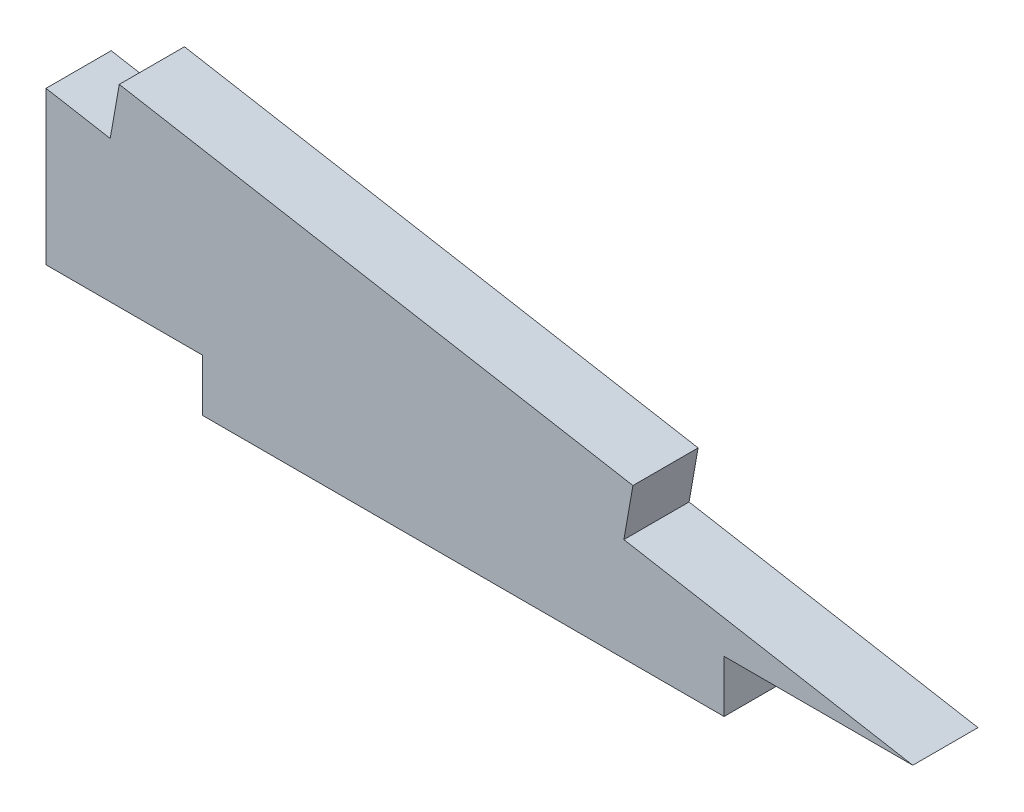
ISO-10303-21;
HEADER;
FILE_DESCRIPTION(('STEP AP214'),'2;1');
FILE_NAME('part.step','',(''),(''),'','','');
FILE_SCHEMA(('AUTOMOTIVE_DESIGN { 1 0 10303 214 1 1 1 1 }'));
ENDSEC;
DATA;
#1=APPLICATION_CONTEXT('core data for automotive mechanical design processes');
#2=APPLICATION_PROTOCOL_DEFINITION('international standard','automotive_design',2000,#1);
#3=PRODUCT_CONTEXT('',#1,'mechanical');
#4=PRODUCT('Part','Part','',(#3));
#5=PRODUCT_RELATED_PRODUCT_CATEGORY('part','',(#4));
#6=PRODUCT_DEFINITION_FORMATION('','',#4);
#7=PRODUCT_DEFINITION_CONTEXT('part definition',#1,'design');
#8=PRODUCT_DEFINITION('design','',#6,#7);
#9=PRODUCT_DEFINITION_SHAPE('','',#8);
#10=(LENGTH_UNIT() NAMED_UNIT(*) SI_UNIT(.MILLI.,.METRE.));
#11=(NAMED_UNIT(*) PLANE_ANGLE_UNIT() SI_UNIT($,.RADIAN.));
#12=(NAMED_UNIT(*) SI_UNIT($,.STERADIAN.) SOLID_ANGLE_UNIT());
#13=UNCERTAINTY_MEASURE_WITH_UNIT(LENGTH_MEASURE(1.E-05),#10,'distance_accuracy_value','');
#14=(GEOMETRIC_REPRESENTATION_CONTEXT(3) GLOBAL_UNCERTAINTY_ASSIGNED_CONTEXT((#13)) GLOBAL_UNIT_ASSIGNED_CONTEXT((#10,
#11,#12)) REPRESENTATION_CONTEXT('',''));
#15=CARTESIAN_POINT('',(0.,0.,0.));
#16=DIRECTION('',(0.,0.,1.));
#17=DIRECTION('',(1.,0.,0.));
#18=AXIS2_PLACEMENT_3D('',#15,#16,#17);
#19=CARTESIAN_POINT('',(-22.4517437496762,2.92182886603974,5.));
#20=DIRECTION('',(0.,1.,0.));
#21=DIRECTION('',(-1.,0.,0.));
#22=AXIS2_PLACEMENT_3D('',#19,#20,#21);
#23=PLANE('',#22);
#24=DIRECTION('',(1.,0.,0.));
#25=VECTOR('',#24,1.);
#26=CARTESIAN_POINT('',(-22.4517437496762,2.92182886603974,0.));
#27=LINE('',#26,#25);
#28=CARTESIAN_POINT('',(-22.4517437496762,2.92182886603974,0.));
#29=VERTEX_POINT('',#28);
#30=CARTESIAN_POINT('',(17.5482562503238,2.92182886603975,0.));
#31=VERTEX_POINT('',#30);
#32=EDGE_CURVE('E157',#29,#31,#27,.T.);
#33=ORIENTED_EDGE('',*,*,#32,.T.);
#34=DIRECTION('',(0.,0.,-1.));
#35=VECTOR('',#34,1.);
#36=CARTESIAN_POINT('',(17.5482562503238,2.92182886603975,5.));
#37=LINE('',#36,#35);
#38=CARTESIAN_POINT('',(17.5482562503238,2.92182886603975,5.));
#39=VERTEX_POINT('',#38);
#40=EDGE_CURVE('E11',#39,#31,#37,.T.);
#41=ORIENTED_EDGE('',*,*,#40,.F.);
#42=DIRECTION('',(1.,0.,0.));
#43=VECTOR('',#42,1.);
#44=CARTESIAN_POINT('',(-22.4517437496762,2.92182886603974,5.));
#45=LINE('',#44,#43);
#46=CARTESIAN_POINT('',(-22.4517437496762,2.92182886603974,5.));
#47=VERTEX_POINT('',#46);
#48=EDGE_CURVE('E179',#47,#39,#45,.T.);
#49=ORIENTED_EDGE('',*,*,#48,.F.);
#50=DIRECTION('',(0.,0.,-1.));
#51=VECTOR('',#50,1.);
#52=CARTESIAN_POINT('',(-22.4517437496762,2.92182886603974,5.));
#53=LINE('',#52,#51);
#54=EDGE_CURVE('E153',#47,#29,#53,.T.);
#55=ORIENTED_EDGE('',*,*,#54,.T.);
#56=EDGE_LOOP('',(#33,#41,#49,#55));
#57=FACE_BOUND('',#56,.T.);
#58=ADVANCED_FACE('F43',(#57),#23,.F.);
#59=CARTESIAN_POINT('',(17.5482562503238,2.92182886603975,5.));
#60=DIRECTION('',(-1.,0.,0.));
#61=DIRECTION('',(0.,0.,1.));
#62=AXIS2_PLACEMENT_3D('',#59,#60,#61);
#63=PLANE('',#62);
#64=DIRECTION('',(0.,1.,0.));
#65=VECTOR('',#64,1.);
#66=CARTESIAN_POINT('',(17.5482562503238,2.92182886603975,0.));
#67=LINE('',#66,#65);
#68=CARTESIAN_POINT('',(17.5482562503238,6.92182886603976,0.));
#69=VERTEX_POINT('',#68);
#70=EDGE_CURVE('E160',#31,#69,#67,.T.);
#71=ORIENTED_EDGE('',*,*,#70,.T.);
#72=DIRECTION('',(0.,0.,-1.));
#73=VECTOR('',#72,1.);
#74=CARTESIAN_POINT('',(17.5482562503238,6.92182886603976,5.));
#75=LINE('',#74,#73);
#76=CARTESIAN_POINT('',(17.5482562503238,6.92182886603976,5.));
#77=VERTEX_POINT('',#76);
#78=EDGE_CURVE('E51',#77,#69,#75,.T.);
#79=ORIENTED_EDGE('',*,*,#78,.F.);
#80=DIRECTION('',(0.,1.,0.));
#81=VECTOR('',#80,1.);
#82=CARTESIAN_POINT('',(17.5482562503238,2.92182886603975,5.));
#83=LINE('',#82,#81);
#84=EDGE_CURVE('E111',#39,#77,#83,.T.);
#85=ORIENTED_EDGE('',*,*,#84,.F.);
#86=ORIENTED_EDGE('',*,*,#40,.T.);
#87=EDGE_LOOP('',(#71,#79,#85,#86));
#88=FACE_BOUND('',#87,.T.);
#89=ADVANCED_FACE('F203',(#88),#63,.F.);
#90=CARTESIAN_POINT('',(24.7855179144858,6.92182886603976,5.));
#91=DIRECTION('',(0.,1.,0.));
#92=DIRECTION('',(-1.,0.,0.));
#93=AXIS2_PLACEMENT_3D('',#90,#91,#92);
#94=PLANE('',#93);
#95=DIRECTION('',(1.,0.,0.));
#96=VECTOR('',#95,1.);
#97=CARTESIAN_POINT('',(24.7855179144858,6.92182886603976,0.));
#98=LINE('',#97,#96);
#99=CARTESIAN_POINT('',(32.0227795786478,6.92182886603976,0.));
#100=VERTEX_POINT('',#99);
#101=EDGE_CURVE('E163',#69,#100,#98,.T.);
#102=ORIENTED_EDGE('',*,*,#101,.T.);
#103=DIRECTION('',(0.,0.,-1.));
#104=VECTOR('',#103,1.);
#105=CARTESIAN_POINT('',(32.0227795786478,6.92182886603976,5.));
#106=LINE('',#105,#104);
#107=CARTESIAN_POINT('',(32.0227795786478,6.92182886603976,5.));
#108=VERTEX_POINT('',#107);
#109=EDGE_CURVE('E195',#108,#100,#106,.T.);
#110=ORIENTED_EDGE('',*,*,#109,.F.);
#111=DIRECTION('',(1.,0.,0.));
#112=VECTOR('',#111,1.);
#113=CARTESIAN_POINT('',(17.5482562503238,6.92182886603976,5.));
#114=LINE('',#113,#112);
#115=EDGE_CURVE('E202',#77,#108,#114,.T.);
#116=ORIENTED_EDGE('',*,*,#115,.F.);
#117=ORIENTED_EDGE('',*,*,#78,.T.);
#118=EDGE_LOOP('',(#102,#110,#116,#117));
#119=FACE_BOUND('',#118,.T.);
#120=ADVANCED_FACE('F200',(#119),#94,.F.);
#121=CARTESIAN_POINT('',(20.9436923572605,8.87537086479272,5.));
#122=DIRECTION('',(-0.17364817766693,-0.984807753012208,0.));
#123=DIRECTION('',(0.984807753012208,-0.17364817766693,0.));
#124=AXIS2_PLACEMENT_3D('',#121,#122,#123);
#125=PLANE('',#124);
#126=DIRECTION('',(-0.984807753012208,0.17364817766693,0.));
#127=VECTOR('',#126,1.);
#128=CARTESIAN_POINT('',(20.9436923572605,8.87537086479272,0.));
#129=LINE('',#128,#127);
#130=CARTESIAN_POINT('',(9.86460513587313,10.8289128635457,0.));
#131=VERTEX_POINT('',#130);
#132=EDGE_CURVE('E166',#100,#131,#129,.T.);
#133=ORIENTED_EDGE('',*,*,#132,.T.);
#134=DIRECTION('',(0.,0.,-1.));
#135=VECTOR('',#134,1.);
#136=CARTESIAN_POINT('',(9.86460513587313,10.8289128635457,5.));
#137=LINE('',#136,#135);
#138=CARTESIAN_POINT('',(9.86460513587313,10.8289128635457,5.));
#139=VERTEX_POINT('',#138);
#140=EDGE_CURVE('E192',#139,#131,#137,.T.);
#141=ORIENTED_EDGE('',*,*,#140,.F.);
#142=DIRECTION('',(-0.984807753012208,0.17364817766693,0.));
#143=VECTOR('',#142,1.);
#144=CARTESIAN_POINT('',(20.9436923572605,8.87537086479272,5.));
#145=LINE('',#144,#143);
#146=EDGE_CURVE('E221',#108,#139,#145,.T.);
#147=ORIENTED_EDGE('',*,*,#146,.F.);
#148=ORIENTED_EDGE('',*,*,#109,.T.);
#149=EDGE_LOOP('',(#133,#141,#147,#148));
#150=FACE_BOUND('',#149,.T.);
#151=ADVANCED_FACE('F212',(#150),#125,.F.);
#152=CARTESIAN_POINT('',(10.5591978465409,14.7681438755945,5.));
#153=DIRECTION('',(-0.984807753012208,0.17364817766693,0.));
#154=DIRECTION('',(-0.17364817766693,-0.984807753012208,0.));
#155=AXIS2_PLACEMENT_3D('',#152,#153,#154);
#156=PLANE('',#155);
#157=DIRECTION('',(0.17364817766693,0.984807753012208,0.));
#158=VECTOR('',#157,1.);
#159=CARTESIAN_POINT('',(10.5591978465409,14.7681438755945,0.));
#160=LINE('',#159,#158);
#161=CARTESIAN_POINT('',(10.5591978465409,14.7681438755945,0.));
#162=VERTEX_POINT('',#161);
#163=EDGE_CURVE('E168',#131,#162,#160,.T.);
#164=ORIENTED_EDGE('',*,*,#163,.T.);
#165=DIRECTION('',(0.,0.,-1.));
#166=VECTOR('',#165,1.);
#167=CARTESIAN_POINT('',(10.5591978465409,14.7681438755945,5.));
#168=LINE('',#167,#166);
#169=CARTESIAN_POINT('',(10.5591978465409,14.7681438755945,5.));
#170=VERTEX_POINT('',#169);
#171=EDGE_CURVE('E189',#170,#162,#168,.T.);
#172=ORIENTED_EDGE('',*,*,#171,.F.);
#173=DIRECTION('',(0.17364817766693,0.984807753012208,0.));
#174=VECTOR('',#173,1.);
#175=CARTESIAN_POINT('',(10.5591978465409,14.7681438755945,5.));
#176=LINE('',#175,#174);
#177=EDGE_CURVE('E218',#139,#170,#176,.T.);
#178=ORIENTED_EDGE('',*,*,#177,.F.);
#179=ORIENTED_EDGE('',*,*,#140,.T.);
#180=EDGE_LOOP('',(#164,#172,#178,#179));
#181=FACE_BOUND('',#180,.T.);
#182=ADVANCED_FACE('F216',(#181),#156,.F.);
#183=CARTESIAN_POINT('',(-28.8331122739474,21.7140709822717,5.));
#184=DIRECTION('',(-0.17364817766693,-0.984807753012208,0.));
#185=DIRECTION('',(0.984807753012208,-0.17364817766693,0.));
#186=AXIS2_PLACEMENT_3D('',#183,#184,#185);
#187=PLANE('',#186);
#188=DIRECTION('',(-0.984807753012208,0.17364817766693,0.));
#189=VECTOR('',#188,1.);
#190=CARTESIAN_POINT('',(-28.8331122739474,21.7140709822717,0.));
#191=LINE('',#190,#189);
#192=CARTESIAN_POINT('',(-28.8331122739474,21.7140709822717,0.));
#193=VERTEX_POINT('',#192);
#194=EDGE_CURVE('E170',#162,#193,#191,.T.);
#195=ORIENTED_EDGE('',*,*,#194,.T.);
#196=DIRECTION('',(0.,0.,-1.));
#197=VECTOR('',#196,1.);
#198=CARTESIAN_POINT('',(-28.8331122739474,21.7140709822717,5.));
#199=LINE('',#198,#197);
#200=CARTESIAN_POINT('',(-28.8331122739474,21.7140709822717,5.));
#201=VERTEX_POINT('',#200);
#202=EDGE_CURVE('E186',#201,#193,#199,.T.);
#203=ORIENTED_EDGE('',*,*,#202,.F.);
#204=DIRECTION('',(-0.984807753012208,0.17364817766693,0.));
#205=VECTOR('',#204,1.);
#206=CARTESIAN_POINT('',(-28.8331122739474,21.7140709822717,5.));
#207=LINE('',#206,#205);
#208=EDGE_CURVE('E220',#170,#201,#207,.T.);
#209=ORIENTED_EDGE('',*,*,#208,.F.);
#210=ORIENTED_EDGE('',*,*,#171,.T.);
#211=EDGE_LOOP('',(#195,#203,#209,#210));
#212=FACE_BOUND('',#211,.T.);
#213=ADVANCED_FACE('F238',(#212),#187,.F.);
#214=CARTESIAN_POINT('',(-29.5277049846152,17.7748399702229,5.));
#215=DIRECTION('',(0.984807753012207,-0.173648177666939,0.));
#216=DIRECTION('',(0.173648177666939,0.984807753012207,0.));
#217=AXIS2_PLACEMENT_3D('',#214,#215,#216);
#218=PLANE('',#217);
#219=DIRECTION('',(-0.173648177666939,-0.984807753012207,0.));
#220=VECTOR('',#219,1.);
#221=CARTESIAN_POINT('',(-29.5277049846152,17.7748399702229,0.));
#222=LINE('',#221,#220);
#223=CARTESIAN_POINT('',(-29.5277049846152,17.7748399702229,0.));
#224=VERTEX_POINT('',#223);
#225=EDGE_CURVE('E172',#193,#224,#222,.T.);
#226=ORIENTED_EDGE('',*,*,#225,.T.);
#227=DIRECTION('',(0.,0.,-1.));
#228=VECTOR('',#227,1.);
#229=CARTESIAN_POINT('',(-29.5277049846152,17.7748399702229,5.));
#230=LINE('',#229,#228);
#231=CARTESIAN_POINT('',(-29.5277049846152,17.7748399702229,5.));
#232=VERTEX_POINT('',#231);
#233=EDGE_CURVE('E183',#232,#224,#230,.T.);
#234=ORIENTED_EDGE('',*,*,#233,.F.);
#235=DIRECTION('',(-0.173648177666939,-0.984807753012207,0.));
#236=VECTOR('',#235,1.);
#237=CARTESIAN_POINT('',(-29.5277049846152,17.7748399702229,5.));
#238=LINE('',#237,#236);
#239=EDGE_CURVE('E223',#201,#232,#238,.T.);
#240=ORIENTED_EDGE('',*,*,#239,.F.);
#241=ORIENTED_EDGE('',*,*,#202,.T.);
#242=EDGE_LOOP('',(#226,#234,#240,#241));
#243=FACE_BOUND('',#242,.T.);
#244=ADVANCED_FACE('F232',(#243),#218,.F.);
#245=CARTESIAN_POINT('',(-34.4517437496762,18.6430808585575,5.));
#246=DIRECTION('',(-0.17364817766693,-0.984807753012208,0.));
#247=DIRECTION('',(0.984807753012208,-0.17364817766693,0.));
#248=AXIS2_PLACEMENT_3D('',#245,#246,#247);
#249=PLANE('',#248);
#250=DIRECTION('',(-0.984807753012208,0.17364817766693,0.));
#251=VECTOR('',#250,1.);
#252=CARTESIAN_POINT('',(-34.4517437496762,18.6430808585575,0.));
#253=LINE('',#252,#251);
#254=CARTESIAN_POINT('',(-34.4517437496762,18.6430808585575,0.));
#255=VERTEX_POINT('',#254);
#256=EDGE_CURVE('E174',#224,#255,#253,.T.);
#257=ORIENTED_EDGE('',*,*,#256,.T.);
#258=DIRECTION('',(0.,0.,-1.));
#259=VECTOR('',#258,1.);
#260=CARTESIAN_POINT('',(-34.4517437496762,18.6430808585575,5.));
#261=LINE('',#260,#259);
#262=CARTESIAN_POINT('',(-34.4517437496762,18.6430808585575,5.));
#263=VERTEX_POINT('',#262);
#264=EDGE_CURVE('E148',#263,#255,#261,.T.);
#265=ORIENTED_EDGE('',*,*,#264,.F.);
#266=DIRECTION('',(-0.984807753012208,0.17364817766693,0.));
#267=VECTOR('',#266,1.);
#268=CARTESIAN_POINT('',(-34.4517437496762,18.6430808585575,5.));
#269=LINE('',#268,#267);
#270=EDGE_CURVE('E139',#232,#263,#269,.T.);
#271=ORIENTED_EDGE('',*,*,#270,.F.);
#272=ORIENTED_EDGE('',*,*,#233,.T.);
#273=EDGE_LOOP('',(#257,#265,#271,#272));
#274=FACE_BOUND('',#273,.T.);
#275=ADVANCED_FACE('F236',(#274),#249,.F.);
#276=CARTESIAN_POINT('',(-34.4517437496762,6.92182886603974,5.));
#277=DIRECTION('',(1.,0.,0.));
#278=DIRECTION('',(0.,0.,-1.));
#279=AXIS2_PLACEMENT_3D('',#276,#277,#278);
#280=PLANE('',#279);
#281=DIRECTION('',(0.,-1.,0.));
#282=VECTOR('',#281,1.);
#283=CARTESIAN_POINT('',(-34.4517437496762,6.92182886603974,0.));
#284=LINE('',#283,#282);
#285=CARTESIAN_POINT('',(-34.4517437496762,6.92182886603974,0.));
#286=VERTEX_POINT('',#285);
#287=EDGE_CURVE('E147',#255,#286,#284,.T.);
#288=ORIENTED_EDGE('',*,*,#287,.T.);
#289=DIRECTION('',(0.,0.,-1.));
#290=VECTOR('',#289,1.);
#291=CARTESIAN_POINT('',(-34.4517437496762,6.92182886603974,5.));
#292=LINE('',#291,#290);
#293=CARTESIAN_POINT('',(-34.4517437496762,6.92182886603974,5.));
#294=VERTEX_POINT('',#293);
#295=EDGE_CURVE('E144',#294,#286,#292,.T.);
#296=ORIENTED_EDGE('',*,*,#295,.F.);
#297=DIRECTION('',(0.,-1.,0.));
#298=VECTOR('',#297,1.);
#299=CARTESIAN_POINT('',(-34.4517437496762,6.92182886603974,5.));
#300=LINE('',#299,#298);
#301=EDGE_CURVE('E133',#263,#294,#300,.T.);
#302=ORIENTED_EDGE('',*,*,#301,.F.);
#303=ORIENTED_EDGE('',*,*,#264,.T.);
#304=EDGE_LOOP('',(#288,#296,#302,#303));
#305=FACE_BOUND('',#304,.T.);
#306=ADVANCED_FACE('F145',(#305),#280,.F.);
#307=CARTESIAN_POINT('',(-22.4517437496762,6.92182886603975,5.));
#308=DIRECTION('',(0.,1.,0.));
#309=DIRECTION('',(-1.,0.,0.));
#310=AXIS2_PLACEMENT_3D('',#307,#308,#309);
#311=PLANE('',#310);
#312=DIRECTION('',(1.,0.,0.));
#313=VECTOR('',#312,1.);
#314=CARTESIAN_POINT('',(-22.4517437496762,6.92182886603975,0.));
#315=LINE('',#314,#313);
#316=CARTESIAN_POINT('',(-22.4517437496762,6.92182886603975,0.));
#317=VERTEX_POINT('',#316);
#318=EDGE_CURVE('E97',#286,#317,#315,.T.);
#319=ORIENTED_EDGE('',*,*,#318,.T.);
#320=DIRECTION('',(0.,0.,-1.));
#321=VECTOR('',#320,1.);
#322=CARTESIAN_POINT('',(-22.4517437496762,6.92182886603975,5.));
#323=LINE('',#322,#321);
#324=CARTESIAN_POINT('',(-22.4517437496762,6.92182886603975,5.));
#325=VERTEX_POINT('',#324);
#326=EDGE_CURVE('E149',#325,#317,#323,.T.);
#327=ORIENTED_EDGE('',*,*,#326,.F.);
#328=DIRECTION('',(1.,0.,0.));
#329=VECTOR('',#328,1.);
#330=CARTESIAN_POINT('',(-22.4517437496762,6.92182886603975,5.));
#331=LINE('',#330,#329);
#332=EDGE_CURVE('E137',#294,#325,#331,.T.);
#333=ORIENTED_EDGE('',*,*,#332,.F.);
#334=ORIENTED_EDGE('',*,*,#295,.T.);
#335=EDGE_LOOP('',(#319,#327,#333,#334));
#336=FACE_BOUND('',#335,.T.);
#337=ADVANCED_FACE('F151',(#336),#311,.F.);
#338=CARTESIAN_POINT('',(-22.4517437496762,2.92182886603974,5.));
#339=DIRECTION('',(1.,0.,0.));
#340=DIRECTION('',(0.,0.,-1.));
#341=AXIS2_PLACEMENT_3D('',#338,#339,#340);
#342=PLANE('',#341);
#343=DIRECTION('',(0.,-1.,0.));
#344=VECTOR('',#343,1.);
#345=CARTESIAN_POINT('',(-22.4517437496762,2.92182886603974,0.));
#346=LINE('',#345,#344);
#347=EDGE_CURVE('E103',#317,#29,#346,.T.);
#348=ORIENTED_EDGE('',*,*,#347,.T.);
#349=ORIENTED_EDGE('',*,*,#54,.F.);
#350=DIRECTION('',(0.,-1.,0.));
#351=VECTOR('',#350,1.);
#352=CARTESIAN_POINT('',(-22.4517437496762,2.92182886603974,5.));
#353=LINE('',#352,#351);
#354=EDGE_CURVE('E59',#325,#47,#353,.T.);
#355=ORIENTED_EDGE('',*,*,#354,.F.);
#356=ORIENTED_EDGE('',*,*,#326,.T.);
#357=EDGE_LOOP('',(#348,#349,#355,#356));
#358=FACE_BOUND('',#357,.T.);
#359=ADVANCED_FACE('F253',(#358),#342,.F.);
#360=CARTESIAN_POINT('',(0.,0.,5.));
#361=DIRECTION('',(0.,0.,1.));
#362=DIRECTION('',(1.,0.,0.));
#363=AXIS2_PLACEMENT_3D('',#360,#361,#362);
#364=PLANE('',#363);
#365=ORIENTED_EDGE('',*,*,#48,.T.);
#366=ORIENTED_EDGE('',*,*,#84,.T.);
#367=ORIENTED_EDGE('',*,*,#115,.T.);
#368=ORIENTED_EDGE('',*,*,#146,.T.);
#369=ORIENTED_EDGE('',*,*,#177,.T.);
#370=ORIENTED_EDGE('',*,*,#208,.T.);
#371=ORIENTED_EDGE('',*,*,#239,.T.);
#372=ORIENTED_EDGE('',*,*,#270,.T.);
#373=ORIENTED_EDGE('',*,*,#301,.T.);
#374=ORIENTED_EDGE('',*,*,#332,.T.);
#375=ORIENTED_EDGE('',*,*,#354,.T.);
#376=EDGE_LOOP('',(#365,#366,#367,#368,#369,#370,#371,#372,#373,#374,#375));
#377=FACE_BOUND('',#376,.T.);
#378=ADVANCED_FACE('F135',(#377),#364,.T.);
#379=CARTESIAN_POINT('',(0.,0.,0.));
#380=DIRECTION('',(0.,0.,1.));
#381=DIRECTION('',(1.,0.,0.));
#382=AXIS2_PLACEMENT_3D('',#379,#380,#381);
#383=PLANE('',#382);
#384=ORIENTED_EDGE('',*,*,#32,.F.);
#385=ORIENTED_EDGE('',*,*,#347,.F.);
#386=ORIENTED_EDGE('',*,*,#318,.F.);
#387=ORIENTED_EDGE('',*,*,#287,.F.);
#388=ORIENTED_EDGE('',*,*,#256,.F.);
#389=ORIENTED_EDGE('',*,*,#225,.F.);
#390=ORIENTED_EDGE('',*,*,#194,.F.);
#391=ORIENTED_EDGE('',*,*,#163,.F.);
#392=ORIENTED_EDGE('',*,*,#132,.F.);
#393=ORIENTED_EDGE('',*,*,#101,.F.);
#394=ORIENTED_EDGE('',*,*,#70,.F.);
#395=EDGE_LOOP('',(#384,#385,#386,#387,#388,#389,#390,#391,#392,#393,#394));
#396=FACE_BOUND('',#395,.T.);
#397=ADVANCED_FACE('F207',(#396),#383,.F.);
#398=CLOSED_SHELL('',(#58,#89,#120,#151,#182,#213,#244,#275,#306,#337,#359,#378,#397));
#399=MANIFOLD_SOLID_BREP('B2',#398);
#400=ADVANCED_BREP_SHAPE_REPRESENTATION('',(#18,#399),#14);
#401=SHAPE_DEFINITION_REPRESENTATION(#9,#400);
ENDSEC;
END-ISO-10303-21;
